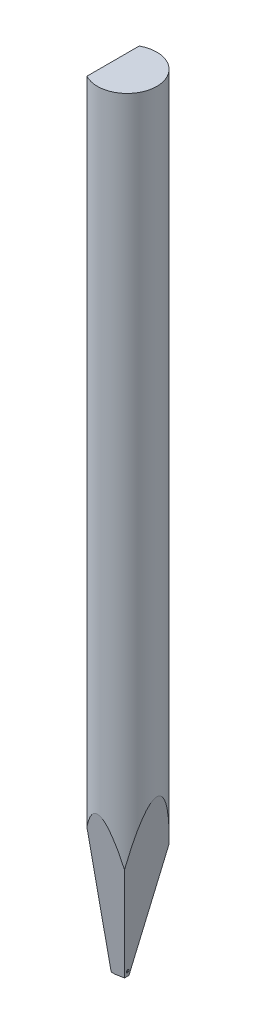
ISO-10303-21;
HEADER;
FILE_DESCRIPTION(('STEP AP214'),'2;1');
FILE_NAME('part.step','',(''),(''),'','','');
FILE_SCHEMA(('AUTOMOTIVE_DESIGN { 1 0 10303 214 1 1 1 1 }'));
ENDSEC;
DATA;
#1=APPLICATION_CONTEXT('core data for automotive mechanical design processes');
#2=APPLICATION_PROTOCOL_DEFINITION('international standard','automotive_design',2000,#1);
#3=PRODUCT_CONTEXT('',#1,'mechanical');
#4=PRODUCT('Part','Part','',(#3));
#5=PRODUCT_RELATED_PRODUCT_CATEGORY('part','',(#4));
#6=PRODUCT_DEFINITION_FORMATION('','',#4);
#7=PRODUCT_DEFINITION_CONTEXT('part definition',#1,'design');
#8=PRODUCT_DEFINITION('design','',#6,#7);
#9=PRODUCT_DEFINITION_SHAPE('','',#8);
#10=(LENGTH_UNIT() NAMED_UNIT(*) SI_UNIT(.MILLI.,.METRE.));
#11=(NAMED_UNIT(*) PLANE_ANGLE_UNIT() SI_UNIT($,.RADIAN.));
#12=(NAMED_UNIT(*) SI_UNIT($,.STERADIAN.) SOLID_ANGLE_UNIT());
#13=UNCERTAINTY_MEASURE_WITH_UNIT(LENGTH_MEASURE(1.E-05),#10,'distance_accuracy_value','');
#14=(GEOMETRIC_REPRESENTATION_CONTEXT(3) GLOBAL_UNCERTAINTY_ASSIGNED_CONTEXT((#13)) GLOBAL_UNIT_ASSIGNED_CONTEXT((#10,
#11,#12)) REPRESENTATION_CONTEXT('',''));
#15=CARTESIAN_POINT('',(0.,0.,0.));
#16=DIRECTION('',(0.,0.,1.));
#17=DIRECTION('',(1.,0.,0.));
#18=AXIS2_PLACEMENT_3D('',#15,#16,#17);
#19=CARTESIAN_POINT('',(26.8738719491216,0.,0.0508));
#20=DIRECTION('',(0.,-0.173648177666931,0.984807753012208));
#21=DIRECTION('',(0.,-0.984807753012208,-0.173648177666931));
#22=AXIS2_PLACEMENT_3D('',#19,#20,#21);
#23=PLANE('',#22);
#24=CARTESIAN_POINT('',(-0.35306,0.02286,0.0548308347789982));
#25=DIRECTION('',(0.,-0.173648177666931,0.984807753012208));
#26=DIRECTION('',(0.,-0.984807753012208,-0.173648177666931));
#27=AXIS2_PLACEMENT_3D('',#24,#25,#26);
#28=ELLIPSE('',#27,0.0232126523477081,0.02286);
#29=CARTESIAN_POINT('',(-0.35306,0.,0.0508000000000026));
#30=VERTEX_POINT('',#29);
#31=CARTESIAN_POINT('',(-0.37592,0.02286,0.0548308347789982));
#32=VERTEX_POINT('',#31);
#33=EDGE_CURVE('E204',#30,#32,#28,.F.);
#34=ORIENTED_EDGE('',*,*,#33,.F.);
#35=DIRECTION('',(-1.,0.,0.));
#36=VECTOR('',#35,1.);
#37=CARTESIAN_POINT('',(26.8738719491216,0.,0.0508));
#38=LINE('',#37,#36);
#39=CARTESIAN_POINT('',(-0.287019999999997,0.,0.0508));
#40=VERTEX_POINT('',#39);
#41=EDGE_CURVE('E268',#40,#30,#38,.T.);
#42=ORIENTED_EDGE('',*,*,#41,.F.);
#43=DIRECTION('',(-0.984346441568213,-0.173566836012845,-0.0306045161452665));
#44=VECTOR('',#43,1.);
#45=CARTESIAN_POINT('',(26.0301980698046,4.64043560289492,0.869033999030531));
#46=LINE('',#45,#44);
#47=CARTESIAN_POINT('',(-0.0117618940403387,0.0485354307393987,0.0593581059596632));
#48=VERTEX_POINT('',#47);
#49=EDGE_CURVE('E265',#48,#40,#46,.T.);
#50=ORIENTED_EDGE('',*,*,#49,.F.);
#51=DIRECTION('',(-0.171087869746036,-0.970287525247814,-0.171087869746036));
#52=VECTOR('',#51,1.);
#53=CARTESIAN_POINT('',(0.766901483986011,4.46455489014234,0.838021483986016));
#54=LINE('',#53,#52);
#55=CARTESIAN_POINT('',(0.523678555180163,3.08516911589156,0.594798555180167));
#56=VERTEX_POINT('',#55);
#57=EDGE_CURVE('E262',#56,#48,#54,.T.);
#58=ORIENTED_EDGE('',*,*,#57,.F.);
#59=CARTESIAN_POINT('',(0.,-0.288101116436578,0.));
#60=DIRECTION('',(0.,-0.173648177666931,0.984807753012208));
#61=DIRECTION('',(0.,-0.984807753012208,-0.173648177666931));
#62=AXIS2_PLACEMENT_3D('',#59,#60,#61);
#63=ELLIPSE('',#62,4.56371043248163,0.792479999999998);
#64=CARTESIAN_POINT('',(-0.37592,3.66844093071415,0.69764511322018));
#65=VERTEX_POINT('',#64);
#66=EDGE_CURVE('E273',#56,#65,#63,.T.);
#67=ORIENTED_EDGE('',*,*,#66,.T.);
#68=DIRECTION('',(0.,0.984807753012208,0.173648177666931));
#69=VECTOR('',#68,1.);
#70=CARTESIAN_POINT('',(-0.37592,20.251112252608,3.62161747949059));
#71=LINE('',#70,#69);
#72=EDGE_CURVE('E287',#32,#65,#71,.T.);
#73=ORIENTED_EDGE('',*,*,#72,.F.);
#74=EDGE_LOOP('',(#34,#42,#50,#58,#67,#73));
#75=FACE_BOUND('',#74,.T.);
#76=ADVANCED_FACE('F46',(#75),#23,.T.);
#77=CARTESIAN_POINT('',(26.8738719491216,0.,-0.0508));
#78=DIRECTION('',(0.,-0.173648177666931,-0.984807753012208));
#79=DIRECTION('',(0.,0.984807753012208,-0.173648177666931));
#80=AXIS2_PLACEMENT_3D('',#77,#78,#79);
#81=PLANE('',#80);
#82=CARTESIAN_POINT('',(-0.35306,0.02286,-0.0548308347789982));
#83=DIRECTION('',(0.,-0.173648177666931,-0.984807753012208));
#84=DIRECTION('',(0.,0.984807753012208,-0.173648177666931));
#85=AXIS2_PLACEMENT_3D('',#82,#83,#84);
#86=ELLIPSE('',#85,0.0232126523477081,0.02286);
#87=CARTESIAN_POINT('',(-0.37592,0.02286,-0.0548308347789982));
#88=VERTEX_POINT('',#87);
#89=CARTESIAN_POINT('',(-0.35306,0.,-0.0508000000000026));
#90=VERTEX_POINT('',#89);
#91=EDGE_CURVE('E201',#88,#90,#86,.F.);
#92=ORIENTED_EDGE('',*,*,#91,.F.);
#93=DIRECTION('',(0.,-0.984807753012208,0.173648177666931));
#94=VECTOR('',#93,1.);
#95=CARTESIAN_POINT('',(-0.37592,20.5255765703836,-3.67001294395617));
#96=LINE('',#95,#94);
#97=CARTESIAN_POINT('',(-0.37592,3.66844093071414,-0.69764511322018));
#98=VERTEX_POINT('',#97);
#99=EDGE_CURVE('E193',#98,#88,#96,.T.);
#100=ORIENTED_EDGE('',*,*,#99,.F.);
#101=CARTESIAN_POINT('',(0.,-0.288101116436578,0.));
#102=DIRECTION('',(0.,-0.173648177666931,-0.984807753012208));
#103=DIRECTION('',(0.,-0.984807753012208,0.173648177666931));
#104=AXIS2_PLACEMENT_3D('',#101,#102,#103);
#105=ELLIPSE('',#104,4.56371043248163,0.792479999999998);
#106=CARTESIAN_POINT('',(0.523678555180163,3.08516911589156,-0.594798555180167));
#107=VERTEX_POINT('',#106);
#108=EDGE_CURVE('E276',#98,#107,#105,.T.);
#109=ORIENTED_EDGE('',*,*,#108,.T.);
#110=DIRECTION('',(0.171087869746036,0.970287525247814,-0.171087869746036));
#111=VECTOR('',#110,1.);
#112=CARTESIAN_POINT('',(0.766901483986011,4.46455489014234,-0.838021483986016));
#113=LINE('',#112,#111);
#114=CARTESIAN_POINT('',(-0.0117618940403387,0.0485354307393987,-0.0593581059596632));
#115=VERTEX_POINT('',#114);
#116=EDGE_CURVE('E290',#115,#107,#113,.T.);
#117=ORIENTED_EDGE('',*,*,#116,.F.);
#118=DIRECTION('',(0.984346441568213,0.173566836012845,-0.0306045161452665));
#119=VECTOR('',#118,1.);
#120=CARTESIAN_POINT('',(26.0301980698046,4.64043560289492,-0.869033999030531));
#121=LINE('',#120,#119);
#122=CARTESIAN_POINT('',(-0.287019999999997,0.,-0.0508));
#123=VERTEX_POINT('',#122);
#124=EDGE_CURVE('E293',#123,#115,#121,.T.);
#125=ORIENTED_EDGE('',*,*,#124,.F.);
#126=DIRECTION('',(-1.,0.,0.));
#127=VECTOR('',#126,1.);
#128=CARTESIAN_POINT('',(26.8738719491216,0.,-0.0508));
#129=LINE('',#128,#127);
#130=EDGE_CURVE('E270',#123,#90,#129,.T.);
#131=ORIENTED_EDGE('',*,*,#130,.T.);
#132=EDGE_LOOP('',(#92,#100,#109,#117,#125,#131));
#133=FACE_BOUND('',#132,.T.);
#134=ADVANCED_FACE('F382',(#133),#81,.T.);
#135=CARTESIAN_POINT('',(-0.28702,0.,27.2760283406468));
#136=DIRECTION('',(-0.173648177666931,0.984807753012208,0.));
#137=DIRECTION('',(-0.984807753012208,-0.173648177666931,0.));
#138=AXIS2_PLACEMENT_3D('',#135,#136,#137);
#139=PLANE('',#138);
#140=DIRECTION('',(-0.984807753012208,-0.173648177666931,0.));
#141=VECTOR('',#140,1.);
#142=CARTESIAN_POINT('',(-0.28702,0.,0.0215899999999984));
#143=LINE('',#142,#141);
#144=CARTESIAN_POINT('',(-0.127,0.0282158434529687,0.0215899999999992));
#145=VERTEX_POINT('',#144);
#146=CARTESIAN_POINT('',(-0.27611358901615,0.00192309451914804,0.02159));
#147=VERTEX_POINT('',#146);
#148=EDGE_CURVE('E248',#145,#147,#143,.T.);
#149=ORIENTED_EDGE('',*,*,#148,.F.);
#150=DIRECTION('',(0.,0.,1.));
#151=VECTOR('',#150,1.);
#152=CARTESIAN_POINT('',(-0.127,0.0282158434529687,27.2760283406468));
#153=LINE('',#152,#151);
#154=CARTESIAN_POINT('',(-0.127,0.0282158434529687,-0.0215899999999992));
#155=VERTEX_POINT('',#154);
#156=EDGE_CURVE('E304',#155,#145,#153,.T.);
#157=ORIENTED_EDGE('',*,*,#156,.F.);
#158=DIRECTION('',(-0.984807753012208,-0.173648177666931,0.));
#159=VECTOR('',#158,1.);
#160=CARTESIAN_POINT('',(-0.28702,0.,-0.0215899999999984));
#161=LINE('',#160,#159);
#162=CARTESIAN_POINT('',(-0.27611358901615,0.00192309451914804,-0.02159));
#163=VERTEX_POINT('',#162);
#164=EDGE_CURVE('E244',#155,#163,#161,.T.);
#165=ORIENTED_EDGE('',*,*,#164,.T.);
#166=CARTESIAN_POINT('',(-0.971260151536871,-0.12065,0.));
#167=DIRECTION('',(-0.173648177666931,0.984807753012208,0.));
#168=DIRECTION('',(-0.984807753012208,-0.173648177666931,0.));
#169=AXIS2_PLACEMENT_3D('',#166,#167,#168);
#170=ELLIPSE('',#169,0.716736574332053,0.12446);
#171=CARTESIAN_POINT('',(-0.28702,0.,-0.0305592719154098));
#172=VERTEX_POINT('',#171);
#173=EDGE_CURVE('E296',#163,#172,#170,.T.);
#174=ORIENTED_EDGE('',*,*,#173,.T.);
#175=DIRECTION('',(0.,0.,-1.));
#176=VECTOR('',#175,1.);
#177=CARTESIAN_POINT('',(-0.28702,0.,27.2760283406468));
#178=LINE('',#177,#176);
#179=EDGE_CURVE('E254',#172,#123,#178,.T.);
#180=ORIENTED_EDGE('',*,*,#179,.T.);
#181=ORIENTED_EDGE('',*,*,#124,.T.);
#182=DIRECTION('',(0.,0.,-1.));
#183=VECTOR('',#182,1.);
#184=CARTESIAN_POINT('',(-0.0117618940403371,0.0485354307393984,27.2760283406468));
#185=LINE('',#184,#183);
#186=EDGE_CURVE('E251',#48,#115,#185,.T.);
#187=ORIENTED_EDGE('',*,*,#186,.F.);
#188=ORIENTED_EDGE('',*,*,#49,.T.);
#189=CARTESIAN_POINT('',(-0.287020000000002,0.,0.0305592719154106));
#190=VERTEX_POINT('',#189);
#191=EDGE_CURVE('E256',#40,#190,#178,.T.);
#192=ORIENTED_EDGE('',*,*,#191,.T.);
#193=EDGE_CURVE('E297',#190,#147,#170,.T.);
#194=ORIENTED_EDGE('',*,*,#193,.T.);
#195=EDGE_LOOP('',(#149,#157,#165,#174,#180,#181,#187,#188,#192,#194));
#196=FACE_BOUND('',#195,.T.);
#197=ADVANCED_FACE('F329',(#196),#139,.F.);
#198=CARTESIAN_POINT('',(26.7627469491216,-0.12065,0.));
#199=DIRECTION('',(-1.,0.,0.));
#200=DIRECTION('',(0.,0.,1.));
#201=AXIS2_PLACEMENT_3D('',#198,#199,#200);
#202=CYLINDRICAL_SURFACE('',#201,0.12446);
#203=DIRECTION('',(-1.,0.,0.));
#204=VECTOR('',#203,1.);
#205=CARTESIAN_POINT('',(26.7627469491216,0.,0.0305592719154106));
#206=LINE('',#205,#204);
#207=CARTESIAN_POINT('',(-0.353059999999999,0.,0.0305592719154102));
#208=VERTEX_POINT('',#207);
#209=EDGE_CURVE('E303',#190,#208,#206,.T.);
#210=ORIENTED_EDGE('',*,*,#209,.T.);
#211=CARTESIAN_POINT('',(-0.35306,0.,0.0305592719154105));
#212=CARTESIAN_POINT('',(-0.353433177495713,-3.4115700480833E-07,0.0305604120455066));
#213=CARTESIAN_POINT('',(-0.35380481473307,9.12342242850821E-06,0.0305232652201642));
#214=CARTESIAN_POINT('',(-0.354530147645717,4.45600474576895E-05,0.0303829399456327));
#215=CARTESIAN_POINT('',(-0.354884006265433,7.03304745953952E-05,0.0302805678869375));
#216=CARTESIAN_POINT('',(-0.355566850741517,0.00013525352697127,0.0300205045838776));
#217=CARTESIAN_POINT('',(-0.355895946578497,0.000174342120017103,0.029863077941626));
#218=CARTESIAN_POINT('',(-0.356528722691961,0.000262443040749248,0.0295043635638638));
#219=CARTESIAN_POINT('',(-0.356832316160832,0.000311487464106235,0.0293029338066951));
#220=CARTESIAN_POINT('',(-0.35763178834136,0.000455814668952359,0.0287023593347366));
#221=CARTESIAN_POINT('',(-0.358100246295292,0.000558098867618606,0.0282685761849347));
#222=CARTESIAN_POINT('',(-0.358965854231094,0.000771572388083865,0.0273372603516326));
#223=CARTESIAN_POINT('',(-0.3593627916304,0.00088278688212757,0.0268395449130287));
#224=CARTESIAN_POINT('',(-0.360434283973501,0.00120938608304231,0.0253297826243709));
#225=CARTESIAN_POINT('',(-0.361030909802205,0.0014270583689581,0.0242634895959853));
#226=CARTESIAN_POINT('',(-0.3620738879093,0.00184491377799584,0.022058395000956));
#227=CARTESIAN_POINT('',(-0.362519839870592,0.00204504928107099,0.0209194096889787));
#228=CARTESIAN_POINT('',(-0.363746617717283,0.00262962458306816,0.0172820300366819));
#229=CARTESIAN_POINT('',(-0.364331796347962,0.00296493482900228,0.0147102260569059));
#230=CARTESIAN_POINT('',(-0.365184550610992,0.00347492912782558,0.00949982929482204));
#231=CARTESIAN_POINT('',(-0.365451107390649,0.00364909750053125,0.00686104966726132));
#232=CARTESIAN_POINT('',(-0.36574279704018,0.00383976034682131,0.00122470237351707));
#233=CARTESIAN_POINT('',(-0.365732691795458,0.00383323950403989,-0.00177558850187591));
#234=CARTESIAN_POINT('',(-0.365383674905822,0.00360491126544181,-0.00773750359229845));
#235=CARTESIAN_POINT('',(-0.365046149857534,0.00338401174443802,-0.0106992375037074));
#236=CARTESIAN_POINT('',(-0.364093178206363,0.0028333681603385,-0.0157018248737312));
#237=CARTESIAN_POINT('',(-0.363583214651265,0.00255201859592672,-0.0177664082167557));
#238=CARTESIAN_POINT('',(-0.362507042078195,0.00203879342347467,-0.020957437104662));
#239=CARTESIAN_POINT('',(-0.362048065533819,0.00183333600841451,-0.0221239201310059));
#240=CARTESIAN_POINT('',(-0.360971530544002,0.00140464298976707,-0.0243770855834131));
#241=CARTESIAN_POINT('',(-0.360354776256994,0.00118150138615126,-0.0254641377562429));
#242=CARTESIAN_POINT('',(-0.359339372379281,0.000877424051785944,-0.0268615508779846));
#243=CARTESIAN_POINT('',(-0.359037413005832,0.000792832100550351,-0.0272409546456175));
#244=CARTESIAN_POINT('',(-0.358391920400731,0.000627987501096351,-0.0279656584366945));
#245=CARTESIAN_POINT('',(-0.358048311130018,0.00054774318860672,-0.0283108939284926));
#246=CARTESIAN_POINT('',(-0.357309539693619,0.000395247281023293,-0.028956025173791));
#247=CARTESIAN_POINT('',(-0.356913719550484,0.000323124188337631,-0.029255213797029));
#248=CARTESIAN_POINT('',(-0.356073993854414,0.000195626538281624,-0.0297774738793415));
#249=CARTESIAN_POINT('',(-0.355630417761091,0.000140146108859585,-0.0300010277049098));
#250=CARTESIAN_POINT('',(-0.354832778100701,6.64124029636152E-05,-0.0302961531870139));
#251=CARTESIAN_POINT('',(-0.354488690980499,4.20751715832177E-05,-0.0303927968636544));
#252=CARTESIAN_POINT('',(-0.353783667176885,8.61483340008675E-06,-0.0305252692481336));
#253=CARTESIAN_POINT('',(-0.353422565772961,-2.98528522923477E-07,-0.0305602596653233));
#254=CARTESIAN_POINT('',(-0.353060000136931,-3.96410119775496E-11,-0.0305592722752992));
#255=B_SPLINE_CURVE_WITH_KNOTS('',3,(#211,#212,#213,#214,#215,#216,#217,#218,#219,#220,#221,
#222,#223,#224,#225,#226,#227,#228,#229,#230,#231,#232,#233,#234,#235,#236,#237,#238,#239,#240,
#241,#242,#243,#244,#245,#246,#247,#248,#249,#250,#251,#252,#253,#254),.UNSPECIFIED.,.F.,.F.,(4,
2,2,2,2,2,2,2,2,2,2,2,2,2,2,2,2,2,2,2,2,4),(0.,0.00111512790921322,0.00221672996284695,
0.00331310867867811,0.00441307970067523,0.00634162491538647,0.00827581109345661,
0.0119781526815259,0.0156902548575423,0.0236223942955505,0.0315798309462445,0.0405550122159596,
0.0494923495034479,0.0559042482343462,0.0597083327673509,0.0634934021345639,0.0649678813134468,
0.0664450941424127,0.0679431143118251,0.0694313922553077,0.0705004947463412,0.0715840246470348),.UNSPECIFIED.);
#256=CARTESIAN_POINT('',(-0.363580535706561,0.00257444728631308,0.0174864972070959));
#257=VERTEX_POINT('',#256);
#258=EDGE_CURVE('E202',#208,#257,#255,.T.);
#259=ORIENTED_EDGE('',*,*,#258,.T.);
#260=CARTESIAN_POINT('',(-0.37592,0.,-0.0305592719154106));
#261=CARTESIAN_POINT('',(-0.365756406466233,0.00252614227819303,-0.0205858973301904));
#262=CARTESIAN_POINT('',(-0.355600000000001,0.00381000000000001,-0.010291546042832));
#263=CARTESIAN_POINT('',(-0.355600000000001,0.00381000000000001,0.010291546042832));
#264=CARTESIAN_POINT('',(-0.365756406466233,0.00252614227819303,0.0205858973301904));
#265=CARTESIAN_POINT('',(-0.37592,0.,0.0305592719154106));
#266=(BOUNDED_CURVE() B_SPLINE_CURVE(3,(#260,#261,#262,#263,#264,#265),.UNSPECIFIED.,.F.,
.F.) B_SPLINE_CURVE_WITH_KNOTS((4,2,4),(1.32272489561682,1.5707963267949,1.81886775797297),
.UNSPECIFIED.) CURVE() GEOMETRIC_REPRESENTATION_ITEM() RATIONAL_B_SPLINE_CURVE((1.,1.,1.,1.,1.,1.)) REPRESENTATION_ITEM(''));
#267=CARTESIAN_POINT('',(-0.363580503871641,0.00257444367399588,-0.0174865227012201));
#268=VERTEX_POINT('',#267);
#269=EDGE_CURVE('E185',#257,#268,#266,.F.);
#270=ORIENTED_EDGE('',*,*,#269,.T.);
#271=CARTESIAN_POINT('',(-0.353059999999999,0.,-0.0305592719154102));
#272=VERTEX_POINT('',#271);
#273=EDGE_CURVE('E79',#268,#272,#255,.T.);
#274=ORIENTED_EDGE('',*,*,#273,.T.);
#275=DIRECTION('',(-1.,0.,0.));
#276=VECTOR('',#275,1.);
#277=CARTESIAN_POINT('',(26.7627469491216,0.,-0.0305592719154106));
#278=LINE('',#277,#276);
#279=EDGE_CURVE('E255',#172,#272,#278,.T.);
#280=ORIENTED_EDGE('',*,*,#279,.F.);
#281=ORIENTED_EDGE('',*,*,#173,.F.);
#282=DIRECTION('',(-1.,0.,0.));
#283=VECTOR('',#282,1.);
#284=CARTESIAN_POINT('',(26.7627469491216,0.00192309451914804,-0.02159));
#285=LINE('',#284,#283);
#286=CARTESIAN_POINT('',(-0.291459716238084,0.00192309451914819,-0.02159));
#287=VERTEX_POINT('',#286);
#288=EDGE_CURVE('E300',#163,#287,#285,.T.);
#289=ORIENTED_EDGE('',*,*,#288,.T.);
#290=CARTESIAN_POINT('',(-0.291459716238094,0.00192309451914803,0.02159));
#291=CARTESIAN_POINT('',(-0.297460178252704,0.00118787390454153,0.025764074381037));
#292=CARTESIAN_POINT('',(-0.306243447027379,0.00118399619739461,0.025784693885801));
#293=CARTESIAN_POINT('',(-0.321343933571846,0.00265973639489125,0.0174092497952559));
#294=CARTESIAN_POINT('',(-0.327055646480616,0.00381585980395339,0.00881095094648123));
#295=CARTESIAN_POINT('',(-0.32700824296768,0.00380408565809902,-0.0089757270638779));
#296=CARTESIAN_POINT('',(-0.321271339247885,0.0026434740968879,-0.0175165527664138));
#297=CARTESIAN_POINT('',(-0.30615317400564,0.00117331647331485,-0.0258300201150016));
#298=CARTESIAN_POINT('',(-0.297433135401437,0.00119056758668176,-0.0257487815160265));
#299=CARTESIAN_POINT('',(-0.291459716238085,0.00192309451914805,-0.02159));
#300=(BOUNDED_CURVE() B_SPLINE_CURVE(3,(#290,#291,#292,#293,#294,#295,#296,#297,#298,#299),
.UNSPECIFIED.,.F.,.F.) B_SPLINE_CURVE_WITH_KNOTS((4,2,2,2,4),(0.,1.78289568717994E-05,
3.5657913743598E-05,5.34868706153965E-05,7.1315827487195E-05),
.UNSPECIFIED.) CURVE() GEOMETRIC_REPRESENTATION_ITEM() RATIONAL_B_SPLINE_CURVE((1.,1.,1.,1.,1.,
1.,1.,1.,1.,1.)) REPRESENTATION_ITEM(''));
#301=CARTESIAN_POINT('',(-0.291459716238084,0.00192309451914775,0.02159));
#302=VERTEX_POINT('',#301);
#303=EDGE_CURVE('E306',#287,#302,#300,.F.);
#304=ORIENTED_EDGE('',*,*,#303,.T.);
#305=DIRECTION('',(-1.,0.,0.));
#306=VECTOR('',#305,1.);
#307=CARTESIAN_POINT('',(26.7627469491216,0.00192309451914804,0.02159));
#308=LINE('',#307,#306);
#309=EDGE_CURVE('E307',#147,#302,#308,.T.);
#310=ORIENTED_EDGE('',*,*,#309,.F.);
#311=ORIENTED_EDGE('',*,*,#193,.F.);
#312=EDGE_LOOP('',(#210,#259,#270,#274,#280,#281,#289,#304,#310,#311));
#313=FACE_BOUND('',#312,.T.);
#314=ADVANCED_FACE('F318',(#313),#202,.F.);
#315=CARTESIAN_POINT('',(0.,0.,0.));
#316=DIRECTION('',(0.,1.,0.));
#317=DIRECTION('',(0.,0.,1.));
#318=AXIS2_PLACEMENT_3D('',#315,#316,#317);
#319=PLANE('',#318);
#320=ORIENTED_EDGE('',*,*,#41,.T.);
#321=DIRECTION('',(0.,0.,-1.));
#322=VECTOR('',#321,1.);
#323=CARTESIAN_POINT('',(-0.35306,0.,26.4375286070088));
#324=LINE('',#323,#322);
#325=EDGE_CURVE('E71',#30,#208,#324,.T.);
#326=ORIENTED_EDGE('',*,*,#325,.T.);
#327=ORIENTED_EDGE('',*,*,#209,.F.);
#328=ORIENTED_EDGE('',*,*,#191,.F.);
#329=EDGE_LOOP('',(#320,#326,#327,#328));
#330=FACE_BOUND('',#329,.T.);
#331=ADVANCED_FACE('F328',(#330),#319,.F.);
#332=ORIENTED_EDGE('',*,*,#279,.T.);
#333=EDGE_CURVE('E200',#272,#90,#324,.T.);
#334=ORIENTED_EDGE('',*,*,#333,.T.);
#335=ORIENTED_EDGE('',*,*,#130,.F.);
#336=ORIENTED_EDGE('',*,*,#179,.F.);
#337=EDGE_LOOP('',(#332,#334,#335,#336));
#338=FACE_BOUND('',#337,.T.);
#339=ADVANCED_FACE('F387',(#338),#319,.F.);
#340=CARTESIAN_POINT('',(0.,21.0312,0.));
#341=DIRECTION('',(0.,-1.,0.));
#342=DIRECTION('',(0.,0.,-1.));
#343=AXIS2_PLACEMENT_3D('',#340,#341,#342);
#344=CYLINDRICAL_SURFACE('',#343,0.792479999999998);
#345=ORIENTED_EDGE('',*,*,#66,.F.);
#346=CARTESIAN_POINT('',(0.,0.115240446574634,0.));
#347=DIRECTION('',(-0.984807753012208,0.173648177666931,0.));
#348=DIRECTION('',(-0.173648177666931,-0.984807753012208,0.));
#349=AXIS2_PLACEMENT_3D('',#346,#347,#348);
#350=ELLIPSE('',#349,4.56371043248165,0.792479999999998);
#351=EDGE_CURVE('E259',#56,#107,#350,.T.);
#352=ORIENTED_EDGE('',*,*,#351,.T.);
#353=ORIENTED_EDGE('',*,*,#108,.F.);
#354=DIRECTION('',(0.,-1.,0.));
#355=VECTOR('',#354,1.);
#356=CARTESIAN_POINT('',(-0.37592,21.0312,-0.69764511322018));
#357=LINE('',#356,#355);
#358=CARTESIAN_POINT('',(-0.37592,21.0312,-0.69764511322018));
#359=VERTEX_POINT('',#358);
#360=EDGE_CURVE('E282',#359,#98,#357,.T.);
#361=ORIENTED_EDGE('',*,*,#360,.F.);
#362=CARTESIAN_POINT('',(0.,21.0312,0.));
#363=DIRECTION('',(0.,1.,0.));
#364=DIRECTION('',(0.,0.,1.));
#365=AXIS2_PLACEMENT_3D('',#362,#363,#364);
#366=CIRCLE('',#365,0.792479999999998);
#367=CARTESIAN_POINT('',(-0.37592,21.0312,0.69764511322018));
#368=VERTEX_POINT('',#367);
#369=EDGE_CURVE('E284',#368,#359,#366,.T.);
#370=ORIENTED_EDGE('',*,*,#369,.F.);
#371=DIRECTION('',(0.,-1.,0.));
#372=VECTOR('',#371,1.);
#373=CARTESIAN_POINT('',(-0.37592,21.0312,0.69764511322018));
#374=LINE('',#373,#372);
#375=EDGE_CURVE('E280',#65,#368,#374,.F.);
#376=ORIENTED_EDGE('',*,*,#375,.F.);
#377=EDGE_LOOP('',(#345,#352,#353,#361,#370,#376));
#378=FACE_BOUND('',#377,.T.);
#379=ADVANCED_FACE('F381',(#378),#344,.T.);
#380=CARTESIAN_POINT('',(-0.37592,21.0312,-0.80247998));
#381=DIRECTION('',(-1.,0.,0.));
#382=DIRECTION('',(0.,0.,1.));
#383=AXIS2_PLACEMENT_3D('',#380,#381,#382);
#384=PLANE('',#383);
#385=DIRECTION('',(0.,0.,-1.));
#386=VECTOR('',#385,1.);
#387=CARTESIAN_POINT('',(-0.37592,0.02286,26.4375286070088));
#388=LINE('',#387,#386);
#389=CARTESIAN_POINT('',(-0.37592,0.0228587179147043,0.00726320425614687));
#390=VERTEX_POINT('',#389);
#391=EDGE_CURVE('E196',#32,#390,#388,.T.);
#392=ORIENTED_EDGE('',*,*,#391,.F.);
#393=ORIENTED_EDGE('',*,*,#72,.T.);
#394=ORIENTED_EDGE('',*,*,#375,.T.);
#395=DIRECTION('',(0.,0.,-1.));
#396=VECTOR('',#395,1.);
#397=CARTESIAN_POINT('',(-0.37592,21.0312,-0.80247998));
#398=LINE('',#397,#396);
#399=EDGE_CURVE('E278',#368,#359,#398,.T.);
#400=ORIENTED_EDGE('',*,*,#399,.T.);
#401=ORIENTED_EDGE('',*,*,#360,.T.);
#402=ORIENTED_EDGE('',*,*,#99,.T.);
#403=CARTESIAN_POINT('',(-0.37592,0.02286,-0.0068781271838278));
#404=VERTEX_POINT('',#403);
#405=EDGE_CURVE('E190',#404,#88,#388,.T.);
#406=ORIENTED_EDGE('',*,*,#405,.F.);
#407=CARTESIAN_POINT('',(-0.37592,0.,0.0305592719154106));
#408=CARTESIAN_POINT('',(-0.37592,0.0122472013785513,0.0231611880183108));
#409=CARTESIAN_POINT('',(-0.37592,0.0241300000000007,0.0119691830559865));
#410=CARTESIAN_POINT('',(-0.37592,0.0241300000000007,-0.0119691830559865));
#411=CARTESIAN_POINT('',(-0.37592,0.0122472013785514,-0.0231611880183109));
#412=CARTESIAN_POINT('',(-0.37592,0.,-0.0305592719154106));
#413=(BOUNDED_CURVE() B_SPLINE_CURVE(3,(#407,#408,#409,#410,#411,#412),.UNSPECIFIED.,.F.,
.F.) B_SPLINE_CURVE_WITH_KNOTS((4,2,4),(1.32272489561682,1.5707963267949,1.81886775797297),
.UNSPECIFIED.) CURVE() GEOMETRIC_REPRESENTATION_ITEM() RATIONAL_B_SPLINE_CURVE((1.,1.,1.,1.,1.,1.)) REPRESENTATION_ITEM(''));
#414=EDGE_CURVE('E178',#404,#390,#413,.F.);
#415=ORIENTED_EDGE('',*,*,#414,.T.);
#416=EDGE_LOOP('',(#392,#393,#394,#400,#401,#402,#406,#415));
#417=FACE_BOUND('',#416,.T.);
#418=ADVANCED_FACE('F191',(#417),#384,.T.);
#419=CARTESIAN_POINT('',(0.,21.0312,0.));
#420=DIRECTION('',(0.,1.,0.));
#421=DIRECTION('',(0.,0.,1.));
#422=AXIS2_PLACEMENT_3D('',#419,#420,#421);
#423=PLANE('',#422);
#424=ORIENTED_EDGE('',*,*,#369,.T.);
#425=ORIENTED_EDGE('',*,*,#399,.F.);
#426=EDGE_LOOP('',(#424,#425));
#427=FACE_BOUND('',#426,.T.);
#428=ADVANCED_FACE('F380',(#427),#423,.T.);
#429=CARTESIAN_POINT('',(-0.0117618940403371,0.0485354307393984,27.2760283406468));
#430=DIRECTION('',(-0.984807753012208,0.173648177666931,0.));
#431=DIRECTION('',(-0.173648177666931,-0.984807753012208,0.));
#432=AXIS2_PLACEMENT_3D('',#429,#430,#431);
#433=PLANE('',#432);
#434=CARTESIAN_POINT('',(0.0133718203501375,0.191075808221561,0.));
#435=DIRECTION('',(-0.984807753012208,0.173648177666931,0.));
#436=DIRECTION('',(0.173648177666931,0.984807753012208,0.));
#437=AXIS2_PLACEMENT_3D('',#434,#435,#436);
#438=ELLIPSE('',#437,0.0439502823592256,0.0315688581959235);
#439=CARTESIAN_POINT('',(0.0210037067897641,0.234358387036002,0.));
#440=VERTEX_POINT('',#439);
#441=EDGE_CURVE('E250',#440,#440,#438,.F.);
#442=ORIENTED_EDGE('',*,*,#441,.F.);
#443=EDGE_LOOP('',(#442));
#444=FACE_BOUND('',#443,.T.);
#445=ORIENTED_EDGE('',*,*,#351,.F.);
#446=ORIENTED_EDGE('',*,*,#57,.T.);
#447=ORIENTED_EDGE('',*,*,#186,.T.);
#448=ORIENTED_EDGE('',*,*,#116,.T.);
#449=EDGE_LOOP('',(#445,#446,#447,#448));
#450=FACE_BOUND('',#449,.T.);
#451=ADVANCED_FACE('F334',(#444,#450),#433,.F.);
#452=CARTESIAN_POINT('',(-0.127,0.0965200000000001,0.02159));
#453=DIRECTION('',(-1.,0.,0.));
#454=DIRECTION('',(0.,0.,1.));
#455=AXIS2_PLACEMENT_3D('',#452,#453,#454);
#456=PLANE('',#455);
#457=ORIENTED_EDGE('',*,*,#156,.T.);
#458=DIRECTION('',(0.,1.,0.));
#459=VECTOR('',#458,1.);
#460=CARTESIAN_POINT('',(-0.127,0.0965200000000001,0.02159));
#461=LINE('',#460,#459);
#462=CARTESIAN_POINT('',(-0.127,0.0965200000000001,0.02159));
#463=VERTEX_POINT('',#462);
#464=EDGE_CURVE('E231',#145,#463,#461,.T.);
#465=ORIENTED_EDGE('',*,*,#464,.T.);
#466=DIRECTION('',(0.,0.,-1.));
#467=VECTOR('',#466,1.);
#468=CARTESIAN_POINT('',(-0.127,0.0965200000000001,0.02159));
#469=LINE('',#468,#467);
#470=CARTESIAN_POINT('',(-0.127,0.0965200000000001,0.01905));
#471=VERTEX_POINT('',#470);
#472=EDGE_CURVE('E238',#463,#471,#469,.T.);
#473=ORIENTED_EDGE('',*,*,#472,.T.);
#474=CARTESIAN_POINT('',(-0.127,0.0965200000000001,0.));
#475=DIRECTION('',(1.,0.,0.));
#476=DIRECTION('',(0.,1.,0.));
#477=AXIS2_PLACEMENT_3D('',#474,#475,#476);
#478=ELLIPSE('',#477,0.0219970452561247,0.01905);
#479=CARTESIAN_POINT('',(-0.127,0.0965200000000001,-0.0190499999999996));
#480=VERTEX_POINT('',#479);
#481=EDGE_CURVE('E224',#480,#471,#478,.F.);
#482=ORIENTED_EDGE('',*,*,#481,.F.);
#483=CARTESIAN_POINT('',(-0.127,0.0965200000000001,-0.02159));
#484=VERTEX_POINT('',#483);
#485=EDGE_CURVE('E234',#480,#484,#469,.T.);
#486=ORIENTED_EDGE('',*,*,#485,.T.);
#487=DIRECTION('',(0.,1.,0.));
#488=VECTOR('',#487,1.);
#489=CARTESIAN_POINT('',(-0.127,0.0965200000000001,-0.02159));
#490=LINE('',#489,#488);
#491=EDGE_CURVE('E232',#155,#484,#490,.T.);
#492=ORIENTED_EDGE('',*,*,#491,.F.);
#493=EDGE_LOOP('',(#457,#465,#473,#482,#486,#492));
#494=FACE_BOUND('',#493,.T.);
#495=ADVANCED_FACE('F493',(#494),#456,.T.);
#496=CARTESIAN_POINT('',(-0.0113398759331575,0.163296403764496,0.));
#497=DIRECTION('',(0.866025403784441,0.499999999999995,0.));
#498=DIRECTION('',(-0.499999999999995,0.866025403784441,0.));
#499=AXIS2_PLACEMENT_3D('',#496,#497,#498);
#500=CONICAL_SURFACE('',#499,0.01905,0.392699081698725);
#501=CARTESIAN_POINT('',(-0.0113398759331575,0.163296403764496,0.));
#502=DIRECTION('',(0.866025403784441,0.499999999999995,0.));
#503=DIRECTION('',(-0.499999999999995,0.866025403784441,0.));
#504=AXIS2_PLACEMENT_3D('',#501,#502,#503);
#505=CIRCLE('',#504,0.01905);
#506=CARTESIAN_POINT('',(-0.0208648759331574,0.17979418770659,0.));
#507=VERTEX_POINT('',#506);
#508=EDGE_CURVE('E218',#507,#507,#505,.T.);
#509=ORIENTED_EDGE('',*,*,#508,.F.);
#510=EDGE_LOOP('',(#509));
#511=FACE_BOUND('',#510,.T.);
#512=ORIENTED_EDGE('',*,*,#441,.T.);
#513=EDGE_LOOP('',(#512));
#514=FACE_BOUND('',#513,.T.);
#515=ADVANCED_FACE('F498',(#511,#514),#500,.F.);
#516=CARTESIAN_POINT('',(-0.236844167394209,0.0965200000000001,0.));
#517=DIRECTION('',(-0.500000000000004,-0.866025403784436,0.));
#518=DIRECTION('',(0.866025403784436,-0.500000000000004,0.));
#519=AXIS2_PLACEMENT_3D('',#516,#517,#518);
#520=CYLINDRICAL_SURFACE('',#519,0.02159);
#521=DIRECTION('',(-0.500000000000004,-0.866025403784436,0.));
#522=VECTOR('',#521,1.);
#523=CARTESIAN_POINT('',(-0.219427511532293,0.12668653285078,0.02159));
#524=LINE('',#523,#522);
#525=CARTESIAN_POINT('',(-0.236844167394209,0.0965200000000001,0.02159));
#526=VERTEX_POINT('',#525);
#527=EDGE_CURVE('E241',#526,#302,#524,.T.);
#528=ORIENTED_EDGE('',*,*,#527,.T.);
#529=CARTESIAN_POINT('',(-0.291459716238085,0.00192309451914805,-0.02159));
#530=CARTESIAN_POINT('',(-0.297383979721852,0.00611433188257335,-0.0215899999999999));
#531=CARTESIAN_POINT('',(-0.301733160649781,0.00854624116102961,-0.0186086372073556));
#532=CARTESIAN_POINT('',(-0.30790293588728,0.0125135112255706,-0.0106629370188484));
#533=CARTESIAN_POINT('',(-0.309420874550645,0.0139689586247198,-0.00538091032294038));
#534=CARTESIAN_POINT('',(-0.309447834512819,0.0139710310638174,0.00528216693533532));
#535=CARTESIAN_POINT('',(-0.307946709428881,0.0125153242401024,0.0105947996912558));
#536=CARTESIAN_POINT('',(-0.301799168983652,0.00854374566164879,0.0185737052336737));
#537=CARTESIAN_POINT('',(-0.297408393167862,0.00612658454884149,0.0215899999999974));
#538=CARTESIAN_POINT('',(-0.291459716238094,0.00192309451914803,0.02159));
#539=(BOUNDED_CURVE() B_SPLINE_CURVE(3,(#529,#530,#531,#532,#533,#534,#535,#536,#537,#538),
.UNSPECIFIED.,.F.,.F.) B_SPLINE_CURVE_WITH_KNOTS((4,2,2,2,4),(0.,1.78289568717994E-05,
3.5657913743598E-05,5.34868706153965E-05,7.1315827487195E-05),
.UNSPECIFIED.) CURVE() GEOMETRIC_REPRESENTATION_ITEM() RATIONAL_B_SPLINE_CURVE((1.,1.,1.,1.,1.,
1.,1.,1.,1.,1.)) REPRESENTATION_ITEM(''));
#540=EDGE_CURVE('E440',#302,#287,#539,.F.);
#541=ORIENTED_EDGE('',*,*,#540,.T.);
#542=DIRECTION('',(0.500000000000004,0.866025403784436,0.));
#543=VECTOR('',#542,1.);
#544=CARTESIAN_POINT('',(-0.236844167394209,0.0965200000000001,-0.02159));
#545=LINE('',#544,#543);
#546=CARTESIAN_POINT('',(-0.236844167394209,0.0965200000000001,-0.02159));
#547=VERTEX_POINT('',#546);
#548=EDGE_CURVE('E245',#287,#547,#545,.T.);
#549=ORIENTED_EDGE('',*,*,#548,.T.);
#550=CARTESIAN_POINT('',(-0.236844167394209,0.0965200000000001,0.));
#551=DIRECTION('',(0.,-1.,0.));
#552=DIRECTION('',(-1.,0.,0.));
#553=AXIS2_PLACEMENT_3D('',#550,#551,#552);
#554=ELLIPSE('',#553,0.0249299846236081,0.02159);
#555=EDGE_CURVE('E242',#547,#526,#554,.F.);
#556=ORIENTED_EDGE('',*,*,#555,.T.);
#557=EDGE_LOOP('',(#528,#541,#549,#556));
#558=FACE_BOUND('',#557,.T.);
#559=ADVANCED_FACE('F331',(#558),#520,.F.);
#560=CARTESIAN_POINT('',(0.,0.,0.02159));
#561=DIRECTION('',(0.,0.,-1.));
#562=DIRECTION('',(-1.,0.,0.));
#563=AXIS2_PLACEMENT_3D('',#560,#561,#562);
#564=PLANE('',#563);
#565=ORIENTED_EDGE('',*,*,#148,.T.);
#566=ORIENTED_EDGE('',*,*,#309,.T.);
#567=ORIENTED_EDGE('',*,*,#527,.F.);
#568=DIRECTION('',(-1.,0.,0.));
#569=VECTOR('',#568,1.);
#570=CARTESIAN_POINT('',(-0.261774152017817,0.0965200000000001,0.02159));
#571=LINE('',#570,#569);
#572=EDGE_CURVE('E228',#463,#526,#571,.T.);
#573=ORIENTED_EDGE('',*,*,#572,.F.);
#574=ORIENTED_EDGE('',*,*,#464,.F.);
#575=EDGE_LOOP('',(#565,#566,#567,#573,#574));
#576=FACE_BOUND('',#575,.T.);
#577=ADVANCED_FACE('F462',(#576),#564,.T.);
#578=CARTESIAN_POINT('',(0.,0.,-0.02159));
#579=DIRECTION('',(0.,0.,-1.));
#580=DIRECTION('',(-1.,0.,0.));
#581=AXIS2_PLACEMENT_3D('',#578,#579,#580);
#582=PLANE('',#581);
#583=ORIENTED_EDGE('',*,*,#491,.T.);
#584=DIRECTION('',(-1.,0.,0.));
#585=VECTOR('',#584,1.);
#586=CARTESIAN_POINT('',(-0.261774152017817,0.0965200000000001,-0.02159));
#587=LINE('',#586,#585);
#588=EDGE_CURVE('E227',#484,#547,#587,.T.);
#589=ORIENTED_EDGE('',*,*,#588,.T.);
#590=ORIENTED_EDGE('',*,*,#548,.F.);
#591=ORIENTED_EDGE('',*,*,#288,.F.);
#592=ORIENTED_EDGE('',*,*,#164,.F.);
#593=EDGE_LOOP('',(#583,#589,#590,#591,#592));
#594=FACE_BOUND('',#593,.T.);
#595=ADVANCED_FACE('F449',(#594),#582,.F.);
#596=CARTESIAN_POINT('',(-0.261774152017817,0.0965200000000001,0.02159));
#597=DIRECTION('',(0.,-1.,0.));
#598=DIRECTION('',(0.,0.,-1.));
#599=AXIS2_PLACEMENT_3D('',#596,#597,#598);
#600=PLANE('',#599);
#601=ORIENTED_EDGE('',*,*,#588,.F.);
#602=ORIENTED_EDGE('',*,*,#485,.F.);
#603=CARTESIAN_POINT('',(-0.127,0.0965200000000001,0.));
#604=DIRECTION('',(0.,1.,0.));
#605=DIRECTION('',(1.,0.,0.));
#606=AXIS2_PLACEMENT_3D('',#603,#604,#605);
#607=ELLIPSE('',#606,0.0381000000000004,0.01905);
#608=EDGE_CURVE('E221',#471,#480,#607,.F.);
#609=ORIENTED_EDGE('',*,*,#608,.F.);
#610=ORIENTED_EDGE('',*,*,#472,.F.);
#611=ORIENTED_EDGE('',*,*,#572,.T.);
#612=ORIENTED_EDGE('',*,*,#555,.F.);
#613=EDGE_LOOP('',(#601,#602,#609,#610,#611,#612));
#614=FACE_BOUND('',#613,.T.);
#615=ADVANCED_FACE('F600',(#614),#600,.T.);
#616=CARTESIAN_POINT('',(-0.36417171334658,-0.0404111525448111,0.));
#617=DIRECTION('',(0.866025403784441,0.499999999999995,0.));
#618=DIRECTION('',(-0.499999999999995,0.866025403784441,0.));
#619=AXIS2_PLACEMENT_3D('',#616,#617,#618);
#620=CYLINDRICAL_SURFACE('',#619,0.01905);
#621=ORIENTED_EDGE('',*,*,#481,.T.);
#622=ORIENTED_EDGE('',*,*,#608,.T.);
#623=EDGE_LOOP('',(#621,#622));
#624=FACE_BOUND('',#623,.T.);
#625=ORIENTED_EDGE('',*,*,#508,.T.);
#626=EDGE_LOOP('',(#625));
#627=FACE_BOUND('',#626,.T.);
#628=ADVANCED_FACE('F400',(#624,#627),#620,.F.);
#629=CARTESIAN_POINT('',(-0.291459716238085,0.00192309451914805,-0.02159));
#630=CARTESIAN_POINT('',(-0.297433135401437,0.00119056758668176,-0.0257487815160265));
#631=CARTESIAN_POINT('',(-0.30615317400564,0.00117331647331485,-0.0258300201150016));
#632=CARTESIAN_POINT('',(-0.321271339247885,0.0026434740968879,-0.0175165527664138));
#633=CARTESIAN_POINT('',(-0.32700824296768,0.00380408565809902,-0.0089757270638779));
#634=CARTESIAN_POINT('',(-0.327055646480616,0.00381585980395339,0.00881095094648123));
#635=CARTESIAN_POINT('',(-0.321343933571846,0.00265973639489125,0.0174092497952559));
#636=CARTESIAN_POINT('',(-0.306243447027379,0.00118399619739461,0.025784693885801));
#637=CARTESIAN_POINT('',(-0.297460178252704,0.00118787390454153,0.025764074381037));
#638=CARTESIAN_POINT('',(-0.291459716238094,0.00192309451914803,0.02159));
#639=CARTESIAN_POINT('',(-0.291459716238085,0.00192309451914805,-0.02159));
#640=CARTESIAN_POINT('',(-0.296796002112849,0.00192449795599981,-0.0215901736060601));
#641=CARTESIAN_POINT('',(-0.30299154166563,0.00239642364959236,-0.020038050843387));
#642=CARTESIAN_POINT('',(-0.312315850395176,0.00339394361065903,-0.0121717058920144));
#643=CARTESIAN_POINT('',(-0.31528339282978,0.0038078591560077,-0.00609131901209346));
#644=CARTESIAN_POINT('',(-0.315317044778215,0.00381212141269104,0.00597961615223374));
#645=CARTESIAN_POINT('',(-0.312370383878009,0.00340068813924407,0.0120950595085349));
#646=CARTESIAN_POINT('',(-0.303067503821679,0.00240198827962979,0.0200043958996332));
#647=CARTESIAN_POINT('',(-0.296823549557194,0.00192438079889811,0.0215908891357723));
#648=CARTESIAN_POINT('',(-0.291459716238094,0.00192309451914803,0.02159));
#649=CARTESIAN_POINT('',(-0.291459716238085,0.00192309451914805,-0.02159));
#650=CARTESIAN_POINT('',(-0.297383979721852,0.00611433188257335,-0.0215899999999999));
#651=CARTESIAN_POINT('',(-0.301733160649781,0.00854624116102961,-0.0186086372073556));
#652=CARTESIAN_POINT('',(-0.30790293588728,0.0125135112255706,-0.0106629370188484));
#653=CARTESIAN_POINT('',(-0.309420874550645,0.0139689586247198,-0.00538091032294038));
#654=CARTESIAN_POINT('',(-0.309447834512819,0.0139710310638174,0.00528216693533532));
#655=CARTESIAN_POINT('',(-0.307946709428881,0.0125153242401024,0.0105947996912558));
#656=CARTESIAN_POINT('',(-0.301799168983652,0.00854374566164879,0.0185737052336737));
#657=CARTESIAN_POINT('',(-0.297408393167862,0.00612658454884149,0.0215899999999974));
#658=CARTESIAN_POINT('',(-0.291459716238094,0.00192309451914803,0.02159));
#659=(BOUNDED_SURFACE() B_SPLINE_SURFACE(2,3,((#629,#630,#631,#632,#633,#634,#635,#636,#637,
#638),(#639,#640,#641,#642,#643,#644,#645,#646,#647,#648),(#649,#650,#651,#652,#653,#654,#655,
#656,#657,#658)),.UNSPECIFIED.,.F.,.F.,.F.) B_SPLINE_SURFACE_WITH_KNOTS((3,3),(4,2,2,2,4),(0.,
1.),(0.,1.78289568717994E-05,3.5657913743598E-05,5.34868706153965E-05,7.1315827487195E-05),
.UNSPECIFIED.) GEOMETRIC_REPRESENTATION_ITEM() RATIONAL_B_SPLINE_SURFACE(((1.,1.,1.,1.,1.,1.,1.,
1.,1.,1.),(0.765986092483117,0.830140123377273,0.851193854294569,0.869277247392156,
0.866031460819852,0.866019402678443,0.869278520414834,0.851361266148128,0.830381312113332,
0.765986092483173),(1.,1.,1.,1.,1.,1.,1.,1.,1.,1.))) REPRESENTATION_ITEM('') SURFACE());
#660=ORIENTED_EDGE('',*,*,#303,.F.);
#661=ORIENTED_EDGE('',*,*,#540,.F.);
#662=EDGE_LOOP('',(#660,#661));
#663=FACE_BOUND('',#662,.T.);
#664=ADVANCED_FACE('F394',(#663),#659,.T.);
#665=CARTESIAN_POINT('',(-0.37592,0.,0.0305592719154106));
#666=CARTESIAN_POINT('',(-0.365756406466233,0.00252614227819303,0.0205858973301904));
#667=CARTESIAN_POINT('',(-0.355600000000001,0.00381000000000001,0.010291546042832));
#668=CARTESIAN_POINT('',(-0.355600000000001,0.00381000000000001,-0.010291546042832));
#669=CARTESIAN_POINT('',(-0.365756406466233,0.00252614227819303,-0.0205858973301904));
#670=CARTESIAN_POINT('',(-0.37592,0.,-0.0305592719154106));
#671=CARTESIAN_POINT('',(-0.37592,0.,0.0305592719154106));
#672=CARTESIAN_POINT('',(-0.375920000000028,0.00252701262539178,0.0205824557074885));
#673=CARTESIAN_POINT('',(-0.375920000000001,0.00381000000000114,0.010291546042832));
#674=CARTESIAN_POINT('',(-0.375920000000001,0.00381000000000114,-0.010291546042832));
#675=CARTESIAN_POINT('',(-0.375920000000028,0.0025270126253917,-0.0205824557074884));
#676=CARTESIAN_POINT('',(-0.37592,0.,-0.0305592719154106));
#677=CARTESIAN_POINT('',(-0.37592,0.,0.0305592719154106));
#678=CARTESIAN_POINT('',(-0.37592,0.0122472013785513,0.0231611880183108));
#679=CARTESIAN_POINT('',(-0.37592,0.0241300000000007,0.0119691830559865));
#680=CARTESIAN_POINT('',(-0.37592,0.0241300000000007,-0.0119691830559865));
#681=CARTESIAN_POINT('',(-0.37592,0.0122472013785514,-0.0231611880183109));
#682=CARTESIAN_POINT('',(-0.37592,0.,-0.0305592719154106));
#683=(BOUNDED_SURFACE() B_SPLINE_SURFACE(2,3,((#665,#666,#667,#668,#669,#670),(#671,#672,#673,
#674,#675,#676),(#677,#678,#679,#680,#681,#682)),.UNSPECIFIED.,.F.,.F.,
.F.) B_SPLINE_SURFACE_WITH_KNOTS((3,3),(4,2,4),(0.,1.),(1.32272489561682,1.5707963267949,
1.81886775797297),.UNSPECIFIED.) GEOMETRIC_REPRESENTATION_ITEM() RATIONAL_B_SPLINE_SURFACE(((1.,
1.,1.,1.,1.,1.),(0.707106781186548,0.707106781186548,0.707106781186556,0.707106781186556,
0.707106781186548,0.707106781186548),(1.,1.,1.,1.,1.,1.))) REPRESENTATION_ITEM('') SURFACE());
#684=CARTESIAN_POINT('',(-0.363592757608991,0.00257107156250729,-0.0175079156899618));
#685=CARTESIAN_POINT('',(-0.363781382637107,0.00266700176199599,-0.0168041859780137));
#686=CARTESIAN_POINT('',(-0.364077098538886,0.00282459338532987,-0.0161646680202825));
#687=CARTESIAN_POINT('',(-0.36493602179249,0.00331992576531089,-0.0147910025685179));
#688=CARTESIAN_POINT('',(-0.365557458545426,0.00370241544010288,-0.0141074558188028));
#689=CARTESIAN_POINT('',(-0.367280735944216,0.00491315352729751,-0.0125388640043048));
#690=CARTESIAN_POINT('',(-0.368427001671404,0.00586864329982001,-0.0118225712211394));
#691=CARTESIAN_POINT('',(-0.371093050979799,0.00861963301296783,-0.0102983510565527));
#692=CARTESIAN_POINT('',(-0.372501272211848,0.0105943352428497,-0.00963313512968514));
#693=CARTESIAN_POINT('',(-0.374655123823463,0.0149679189002834,-0.00846138459774749));
#694=CARTESIAN_POINT('',(-0.375388389326753,0.0173737868265777,-0.00795791717210203));
#695=CARTESIAN_POINT('',(-0.375770806163907,0.020220860057391,-0.00739857938471502));
#696=CARTESIAN_POINT('',(-0.375813566766674,0.0206197024776863,-0.00732103476400241));
#697=CARTESIAN_POINT('',(-0.37589508975257,0.0216312139660147,-0.00712562887574257));
#698=CARTESIAN_POINT('',(-0.375919694543993,0.0222450615323023,-0.00700820507665172));
#699=CARTESIAN_POINT('',(-0.37592,0.0228599999999996,-0.00689060871436534));
#700=B_SPLINE_CURVE_WITH_KNOTS('',3,(#684,#685,#686,#687,#688,#689,#690,#691,#692,#693,#694,
#695,#696,#697,#698,#699),.UNSPECIFIED.,.F.,.F.,(4,2,2,2,2,2,2,4),(0.,0.00215288500068576,
0.00509123020711225,0.00998551375921227,0.0173997815325097,0.0249473187787283,
0.0261727812820828,0.028048411442072),.UNSPECIFIED.);
#701=EDGE_CURVE('E12',#268,#404,#700,.T.);
#702=CARTESIAN_POINT('',(-0.363592757609499,0.00257107156256552,0.017507915690691));
#703=CARTESIAN_POINT('',(-0.363781382646146,0.00266700174903378,0.016804185978031));
#704=CARTESIAN_POINT('',(-0.36407709854625,0.00282459337498046,0.0161646680196502));
#705=CARTESIAN_POINT('',(-0.364936021787577,0.00331992577455797,0.0147910025665539));
#706=CARTESIAN_POINT('',(-0.365557458526869,0.00370241547122235,0.0141074558161935));
#707=CARTESIAN_POINT('',(-0.367280735918765,0.00491315357847796,0.0125388639989476));
#708=CARTESIAN_POINT('',(-0.36842700167156,0.00586864332359259,0.0118225712145521));
#709=CARTESIAN_POINT('',(-0.371093051008413,0.00861963300676918,0.0102983510499517));
#710=CARTESIAN_POINT('',(-0.372501272227079,0.0105943352545502,0.00963313512407032));
#711=CARTESIAN_POINT('',(-0.37465512382697,0.0149679189269808,0.00846138459308358));
#712=CARTESIAN_POINT('',(-0.375388389332104,0.0173737868500371,0.00795791716740676));
#713=CARTESIAN_POINT('',(-0.375770806165494,0.0202208600719297,0.0073985793818728));
#714=CARTESIAN_POINT('',(-0.375813566767018,0.0206197024825258,0.00732103476305923));
#715=CARTESIAN_POINT('',(-0.375895089752372,0.0216312139628227,0.00712562887636729));
#716=CARTESIAN_POINT('',(-0.375919694543828,0.0222450615308553,0.00700820507696791));
#717=CARTESIAN_POINT('',(-0.37592,0.02286,0.00689060871436433));
#718=B_SPLINE_CURVE_WITH_KNOTS('',3,(#702,#703,#704,#705,#706,#707,#708,#709,#710,#711,#712,
#713,#714,#715,#716,#717),.UNSPECIFIED.,.F.,.F.,(4,2,2,2,2,2,2,4),(0.,0.00215288500263541,
0.00509123021150399,0.00998551377412704,0.0173997815496075,0.0249473187989675,
0.0261727812723757,0.0280484114373523),.UNSPECIFIED.);
#719=EDGE_CURVE('E64',#390,#257,#718,.F.);
#720=CARTESIAN_POINT('',(-0.37592,0.,0.0305592719154106));
#721=CARTESIAN_POINT('',(-0.365756406466233,0.00252614227819303,0.0205858973301904));
#722=CARTESIAN_POINT('',(-0.355600000000001,0.00381000000000001,0.010291546042832));
#723=CARTESIAN_POINT('',(-0.355600000000001,0.00381000000000001,-0.010291546042832));
#724=CARTESIAN_POINT('',(-0.365756406466233,0.00252614227819303,-0.0205858973301904));
#725=CARTESIAN_POINT('',(-0.37592,0.,-0.0305592719154106));
#726=CARTESIAN_POINT('',(-0.37592,0.,0.0305592719154106));
#727=CARTESIAN_POINT('',(-0.375920000000028,0.00252701262539178,0.0205824557074885));
#728=CARTESIAN_POINT('',(-0.375920000000001,0.00381000000000114,0.010291546042832));
#729=CARTESIAN_POINT('',(-0.375920000000001,0.00381000000000114,-0.010291546042832));
#730=CARTESIAN_POINT('',(-0.375920000000028,0.0025270126253917,-0.0205824557074884));
#731=CARTESIAN_POINT('',(-0.37592,0.,-0.0305592719154106));
#732=CARTESIAN_POINT('',(-0.37592,0.,0.0305592719154106));
#733=CARTESIAN_POINT('',(-0.37592,0.0122472013785513,0.0231611880183108));
#734=CARTESIAN_POINT('',(-0.37592,0.0241300000000007,0.0119691830559865));
#735=CARTESIAN_POINT('',(-0.37592,0.0241300000000007,-0.0119691830559865));
#736=CARTESIAN_POINT('',(-0.37592,0.0122472013785514,-0.0231611880183109));
#737=CARTESIAN_POINT('',(-0.37592,0.,-0.0305592719154106));
#738=CARTESIAN_POINT('',(-0.37592,0.,0.0305592719154106));
#739=CARTESIAN_POINT('',(-0.37592,0.0122905026102565,0.023172675684665));
#740=CARTESIAN_POINT('',(-0.37592,0.0242205209817011,0.0119766565475893));
#741=CARTESIAN_POINT('',(-0.37592,0.0242205209817011,-0.0119766565475893));
#742=CARTESIAN_POINT('',(-0.37592,0.0122905026102566,-0.0231726756846652));
#743=CARTESIAN_POINT('',(-0.37592,0.,-0.0305592719154106));
#744=CARTESIAN_POINT('',(-0.37592,0.,0.0305592719154106));
#745=CARTESIAN_POINT('',(-0.37592,0.0123338038419616,0.0231841633510193));
#746=CARTESIAN_POINT('',(-0.37592,0.0243110419634014,0.011984130039192));
#747=CARTESIAN_POINT('',(-0.37592,0.0243110419634014,-0.011984130039192));
#748=CARTESIAN_POINT('',(-0.37592,0.0123338038419617,-0.0231841633510194));
#749=CARTESIAN_POINT('',(-0.37592,0.,-0.0305592719154106));
#750=(BOUNDED_SURFACE() B_SPLINE_SURFACE(2,3,((#720,#721,#722,#723,#724,#725),(#726,#727,#728,
#729,#730,#731),(#732,#733,#734,#735,#736,#737),(#738,#739,#740,#741,#742,#743),(#744,#745,#746,
#747,#748,#749)),.UNSPECIFIED.,.F.,.F.,.F.) B_SPLINE_SURFACE_WITH_KNOTS((3,2,3),(4,2,4),
(-0.414213562373095,1.,1.0063),(1.32272489561682,1.5707963267949,1.81886775797297),
.UNSPECIFIED.) GEOMETRIC_REPRESENTATION_ITEM() RATIONAL_B_SPLINE_SURFACE(((2.,2.,2.,2.,2.,2.),
(1.,1.,1.00000000000001,1.00000000000001,1.,1.),(1.,1.,1.,1.,1.,1.),(1.,1.,1.,1.,1.,1.),(1.,1.,
1.,1.,1.,1.))) REPRESENTATION_ITEM('') SURFACE());
#751=ORIENTED_EDGE('',*,*,#701,.F.);
#752=ORIENTED_EDGE('',*,*,#269,.F.);
#753=ORIENTED_EDGE('',*,*,#719,.F.);
#754=ORIENTED_EDGE('',*,*,#414,.F.);
#755=EDGE_LOOP('',(#751,#752,#753,#754));
#756=FACE_BOUND('',#755,.T.);
#757=ADVANCED_FACE('F49',(#756),#750,.T.);
#758=CARTESIAN_POINT('',(-0.35306,0.02286,26.4375286070088));
#759=DIRECTION('',(0.,0.,-1.));
#760=DIRECTION('',(-1.,0.,0.));
#761=AXIS2_PLACEMENT_3D('',#758,#759,#760);
#762=CYLINDRICAL_SURFACE('',#761,0.02286);
#763=ORIENTED_EDGE('',*,*,#325,.F.);
#764=ORIENTED_EDGE('',*,*,#33,.T.);
#765=ORIENTED_EDGE('',*,*,#391,.T.);
#766=ORIENTED_EDGE('',*,*,#719,.T.);
#767=ORIENTED_EDGE('',*,*,#258,.F.);
#768=EDGE_LOOP('',(#763,#764,#765,#766,#767));
#769=FACE_BOUND('',#768,.T.);
#770=ADVANCED_FACE('F473',(#769),#762,.T.);
#771=ORIENTED_EDGE('',*,*,#405,.T.);
#772=ORIENTED_EDGE('',*,*,#91,.T.);
#773=ORIENTED_EDGE('',*,*,#333,.F.);
#774=ORIENTED_EDGE('',*,*,#273,.F.);
#775=ORIENTED_EDGE('',*,*,#701,.T.);
#776=EDGE_LOOP('',(#771,#772,#773,#774,#775));
#777=FACE_BOUND('',#776,.T.);
#778=ADVANCED_FACE('F198',(#777),#762,.T.);
#779=CLOSED_SHELL('',(#76,#134,#197,#314,#331,#339,#379,#418,#428,#451,#495,#515,#559,#577,#595,
#615,#628,#664,#757,#770,#778));
#780=MANIFOLD_SOLID_BREP('B2',#779);
#781=ADVANCED_BREP_SHAPE_REPRESENTATION('',(#18,#780),#14);
#782=SHAPE_DEFINITION_REPRESENTATION(#9,#781);
ENDSEC;
END-ISO-10303-21;
